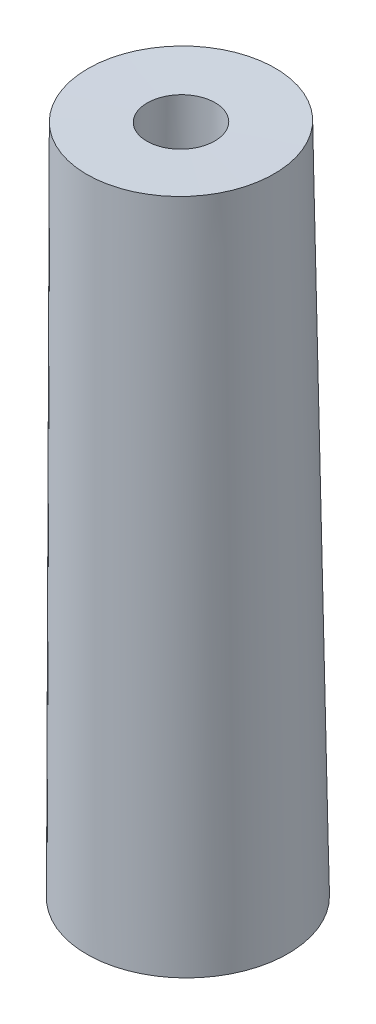
ISO-10303-21;
HEADER;
FILE_DESCRIPTION(('STEP AP214'),'2;1');
FILE_NAME('part.step','',(''),(''),'','','');
FILE_SCHEMA(('AUTOMOTIVE_DESIGN { 1 0 10303 214 1 1 1 1 }'));
ENDSEC;
DATA;
#1=APPLICATION_CONTEXT('core data for automotive mechanical design processes');
#2=APPLICATION_PROTOCOL_DEFINITION('international standard','automotive_design',2000,#1);
#3=PRODUCT_CONTEXT('',#1,'mechanical');
#4=PRODUCT('Part','Part','',(#3));
#5=PRODUCT_RELATED_PRODUCT_CATEGORY('part','',(#4));
#6=PRODUCT_DEFINITION_FORMATION('','',#4);
#7=PRODUCT_DEFINITION_CONTEXT('part definition',#1,'design');
#8=PRODUCT_DEFINITION('design','',#6,#7);
#9=PRODUCT_DEFINITION_SHAPE('','',#8);
#10=(LENGTH_UNIT() NAMED_UNIT(*) SI_UNIT(.MILLI.,.METRE.));
#11=(NAMED_UNIT(*) PLANE_ANGLE_UNIT() SI_UNIT($,.RADIAN.));
#12=(NAMED_UNIT(*) SI_UNIT($,.STERADIAN.) SOLID_ANGLE_UNIT());
#13=UNCERTAINTY_MEASURE_WITH_UNIT(LENGTH_MEASURE(1.E-05),#10,'distance_accuracy_value','');
#14=(GEOMETRIC_REPRESENTATION_CONTEXT(3) GLOBAL_UNCERTAINTY_ASSIGNED_CONTEXT((#13)) GLOBAL_UNIT_ASSIGNED_CONTEXT((#10,
#11,#12)) REPRESENTATION_CONTEXT('',''));
#15=CARTESIAN_POINT('',(0.,0.,0.));
#16=DIRECTION('',(0.,0.,1.));
#17=DIRECTION('',(1.,0.,0.));
#18=AXIS2_PLACEMENT_3D('',#15,#16,#17);
#19=CARTESIAN_POINT('',(5.68527582335221,49.816043976851,0.));
#20=DIRECTION('',(0.0103991004221195,-0.999945927893309,0.));
#21=DIRECTION('',(0.999945927893309,0.0103991004221195,0.));
#22=AXIS2_PLACEMENT_3D('',#19,#20,#21);
#23=CONICAL_SURFACE('',#22,15.686124005123,0.0103992878599294);
#24=CARTESIAN_POINT('',(6.85599643081504,-62.7568956635031,0.));
#25=DIRECTION('',(-0.0103991004221195,0.999945927893309,0.));
#26=DIRECTION('',(-0.999945927893309,-0.0103991004221195,0.));
#27=AXIS2_PLACEMENT_3D('',#24,#25,#26);
#28=CIRCLE('',#27,16.8569079193385);
#29=CARTESIAN_POINT('',(-10.,-62.9321923417627,0.));
#30=VERTEX_POINT('',#29);
#31=EDGE_CURVE('E10',#30,#30,#28,.T.);
#32=ORIENTED_EDGE('',*,*,#31,.T.);
#33=EDGE_LOOP('',(#32));
#34=FACE_BOUND('',#33,.T.);
#35=CARTESIAN_POINT('',(5.68527582335221,49.816043976851,0.));
#36=DIRECTION('',(-0.0103991004221195,0.999945927893309,0.));
#37=DIRECTION('',(-0.999945927893309,-0.0103991004221195,0.));
#38=AXIS2_PLACEMENT_3D('',#35,#36,#37);
#39=CIRCLE('',#38,15.686124005123);
#40=CARTESIAN_POINT('',(-10.,49.652922398088,0.));
#41=VERTEX_POINT('',#40);
#42=EDGE_CURVE('E51',#41,#41,#39,.T.);
#43=ORIENTED_EDGE('',*,*,#42,.F.);
#44=EDGE_LOOP('',(#43));
#45=FACE_BOUND('',#44,.T.);
#46=ADVANCED_FACE('F40',(#34,#45),#23,.T.);
#47=CARTESIAN_POINT('',(6.85707784371094,-62.8608810447116,0.));
#48=DIRECTION('',(-0.0103991004221195,0.999945927893309,0.));
#49=DIRECTION('',(-0.999945927893309,-0.0103991004221195,0.));
#50=AXIS2_PLACEMENT_3D('',#47,#48,#49);
#51=CONICAL_SURFACE('',#50,6.85744864040545,1.56039703893497);
#52=ORIENTED_EDGE('',*,*,#31,.F.);
#53=EDGE_LOOP('',(#52));
#54=FACE_BOUND('',#53,.T.);
#55=CARTESIAN_POINT('',(6.85707784371094,-62.8608810447116,0.));
#56=DIRECTION('',(-0.0103991004221195,0.999945927893309,0.));
#57=DIRECTION('',(-0.999945927893309,-0.0103991004221195,0.));
#58=AXIS2_PLACEMENT_3D('',#55,#56,#57);
#59=CIRCLE('',#58,6.85744864040545);
#60=CARTESIAN_POINT('',(0.,-62.9321923417627,0.));
#61=VERTEX_POINT('',#60);
#62=EDGE_CURVE('E43',#61,#61,#59,.T.);
#63=ORIENTED_EDGE('',*,*,#62,.T.);
#64=EDGE_LOOP('',(#63));
#65=FACE_BOUND('',#64,.T.);
#66=ADVANCED_FACE('F58',(#54,#65),#51,.T.);
#67=CARTESIAN_POINT('',(5.6863572362481,49.7120585956425,0.));
#68=DIRECTION('',(0.0103991004221195,-0.999945927893309,0.));
#69=DIRECTION('',(0.999945927893309,0.0103991004221195,0.));
#70=AXIS2_PLACEMENT_3D('',#67,#68,#69);
#71=CONICAL_SURFACE('',#70,5.68666472618989,0.0103992878599294);
#72=ORIENTED_EDGE('',*,*,#62,.F.);
#73=EDGE_LOOP('',(#72));
#74=FACE_BOUND('',#73,.T.);
#75=CARTESIAN_POINT('',(5.6863572362481,49.7120585956425,0.));
#76=DIRECTION('',(-0.0103991004221195,0.999945927893309,0.));
#77=DIRECTION('',(-0.999945927893309,-0.0103991004221195,0.));
#78=AXIS2_PLACEMENT_3D('',#75,#76,#77);
#79=CIRCLE('',#78,5.68666472618989);
#80=CARTESIAN_POINT('',(0.,49.652922398088,0.));
#81=VERTEX_POINT('',#80);
#82=EDGE_CURVE('E50',#81,#81,#79,.T.);
#83=ORIENTED_EDGE('',*,*,#82,.T.);
#84=EDGE_LOOP('',(#83));
#85=FACE_BOUND('',#84,.T.);
#86=ADVANCED_FACE('F63',(#74,#85),#71,.F.);
#87=CARTESIAN_POINT('',(5.68527582335221,49.816043976851,0.));
#88=DIRECTION('',(-0.0103991004221195,0.999945927893309,0.));
#89=DIRECTION('',(-0.999945927893309,-0.0103991004221195,0.));
#90=AXIS2_PLACEMENT_3D('',#87,#88,#89);
#91=CONICAL_SURFACE('',#90,15.686124005123,1.56039703893497);
#92=ORIENTED_EDGE('',*,*,#82,.F.);
#93=EDGE_LOOP('',(#92));
#94=FACE_BOUND('',#93,.T.);
#95=ORIENTED_EDGE('',*,*,#42,.T.);
#96=EDGE_LOOP('',(#95));
#97=FACE_BOUND('',#96,.T.);
#98=ADVANCED_FACE('F60',(#94,#97),#91,.F.);
#99=CLOSED_SHELL('',(#46,#66,#86,#98));
#100=MANIFOLD_SOLID_BREP('B2',#99);
#101=ADVANCED_BREP_SHAPE_REPRESENTATION('',(#18,#100),#14);
#102=SHAPE_DEFINITION_REPRESENTATION(#9,#101);
ENDSEC;
END-ISO-10303-21;
